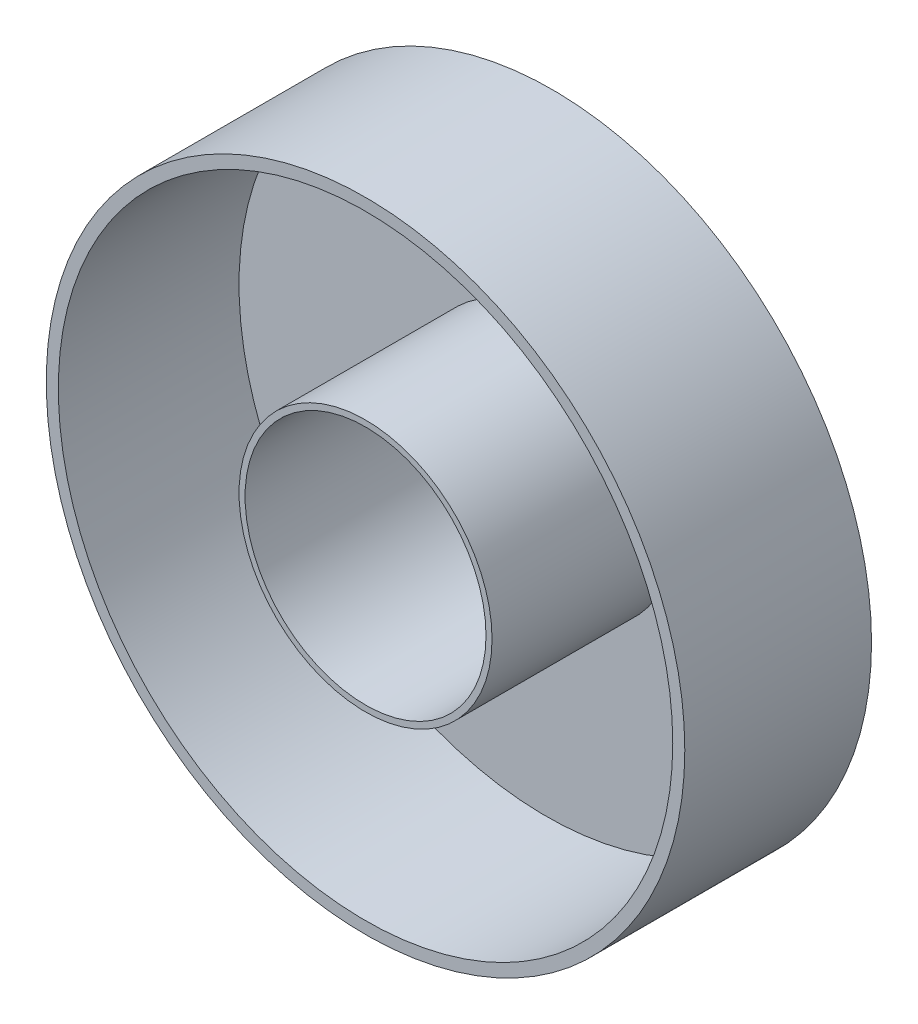
ISO-10303-21;
HEADER;
FILE_DESCRIPTION(('STEP AP214'),'2;1');
FILE_NAME('part.step','',(''),(''),'','','');
FILE_SCHEMA(('AUTOMOTIVE_DESIGN { 1 0 10303 214 1 1 1 1 }'));
ENDSEC;
DATA;
#1=APPLICATION_CONTEXT('core data for automotive mechanical design processes');
#2=APPLICATION_PROTOCOL_DEFINITION('international standard','automotive_design',2000,#1);
#3=PRODUCT_CONTEXT('',#1,'mechanical');
#4=PRODUCT('Part','Part','',(#3));
#5=PRODUCT_RELATED_PRODUCT_CATEGORY('part','',(#4));
#6=PRODUCT_DEFINITION_FORMATION('','',#4);
#7=PRODUCT_DEFINITION_CONTEXT('part definition',#1,'design');
#8=PRODUCT_DEFINITION('design','',#6,#7);
#9=PRODUCT_DEFINITION_SHAPE('','',#8);
#10=(LENGTH_UNIT() NAMED_UNIT(*) SI_UNIT(.MILLI.,.METRE.));
#11=(NAMED_UNIT(*) PLANE_ANGLE_UNIT() SI_UNIT($,.RADIAN.));
#12=(NAMED_UNIT(*) SI_UNIT($,.STERADIAN.) SOLID_ANGLE_UNIT());
#13=UNCERTAINTY_MEASURE_WITH_UNIT(LENGTH_MEASURE(1.E-05),#10,'distance_accuracy_value','');
#14=(GEOMETRIC_REPRESENTATION_CONTEXT(3) GLOBAL_UNCERTAINTY_ASSIGNED_CONTEXT((#13)) GLOBAL_UNIT_ASSIGNED_CONTEXT((#10,
#11,#12)) REPRESENTATION_CONTEXT('',''));
#15=CARTESIAN_POINT('',(0.,0.,0.));
#16=DIRECTION('',(0.,0.,1.));
#17=DIRECTION('',(1.,0.,0.));
#18=AXIS2_PLACEMENT_3D('',#15,#16,#17);
#19=CARTESIAN_POINT('',(0.,0.,15.5));
#20=DIRECTION('',(0.,0.,-1.));
#21=DIRECTION('',(-1.,0.,0.));
#22=AXIS2_PLACEMENT_3D('',#19,#20,#21);
#23=CYLINDRICAL_SURFACE('',#22,10.);
#24=CARTESIAN_POINT('',(0.,0.,15.5));
#25=DIRECTION('',(0.,0.,1.));
#26=DIRECTION('',(1.,0.,0.));
#27=AXIS2_PLACEMENT_3D('',#24,#25,#26);
#28=CIRCLE('',#27,10.);
#29=CARTESIAN_POINT('',(10.,0.,15.5));
#30=VERTEX_POINT('',#29);
#31=EDGE_CURVE('E78',#30,#30,#28,.T.);
#32=ORIENTED_EDGE('',*,*,#31,.T.);
#33=EDGE_LOOP('',(#32));
#34=FACE_BOUND('',#33,.T.);
#35=CARTESIAN_POINT('',(0.,0.,0.5));
#36=DIRECTION('',(0.,0.,1.));
#37=DIRECTION('',(1.,0.,0.));
#38=AXIS2_PLACEMENT_3D('',#35,#36,#37);
#39=CIRCLE('',#38,10.);
#40=CARTESIAN_POINT('',(10.,0.,0.5));
#41=VERTEX_POINT('',#40);
#42=EDGE_CURVE('E84',#41,#41,#39,.T.);
#43=ORIENTED_EDGE('',*,*,#42,.F.);
#44=EDGE_LOOP('',(#43));
#45=FACE_BOUND('',#44,.T.);
#46=ADVANCED_FACE('F71',(#34,#45),#23,.F.);
#47=CARTESIAN_POINT('',(0.,0.,15.5));
#48=DIRECTION('',(0.,0.,-1.));
#49=DIRECTION('',(-1.,0.,0.));
#50=AXIS2_PLACEMENT_3D('',#47,#48,#49);
#51=CYLINDRICAL_SURFACE('',#50,10.5);
#52=CARTESIAN_POINT('',(0.,0.,15.5));
#53=DIRECTION('',(0.,0.,1.));
#54=DIRECTION('',(1.,0.,0.));
#55=AXIS2_PLACEMENT_3D('',#52,#53,#54);
#56=CIRCLE('',#55,10.5);
#57=CARTESIAN_POINT('',(10.5,0.,15.5));
#58=VERTEX_POINT('',#57);
#59=EDGE_CURVE('E12',#58,#58,#56,.F.);
#60=ORIENTED_EDGE('',*,*,#59,.T.);
#61=EDGE_LOOP('',(#60));
#62=FACE_BOUND('',#61,.T.);
#63=CARTESIAN_POINT('',(0.,0.,0.5));
#64=DIRECTION('',(0.,0.,1.));
#65=DIRECTION('',(1.,0.,0.));
#66=AXIS2_PLACEMENT_3D('',#63,#64,#65);
#67=CIRCLE('',#66,10.5);
#68=CARTESIAN_POINT('',(10.5,0.,0.5));
#69=VERTEX_POINT('',#68);
#70=EDGE_CURVE('E74',#69,#69,#67,.F.);
#71=ORIENTED_EDGE('',*,*,#70,.F.);
#72=EDGE_LOOP('',(#71));
#73=FACE_BOUND('',#72,.T.);
#74=ADVANCED_FACE('F93',(#62,#73),#51,.T.);
#75=CARTESIAN_POINT('',(0.,0.,15.5));
#76=DIRECTION('',(0.,0.,1.));
#77=DIRECTION('',(1.,0.,0.));
#78=AXIS2_PLACEMENT_3D('',#75,#76,#77);
#79=PLANE('',#78);
#80=ORIENTED_EDGE('',*,*,#31,.F.);
#81=EDGE_LOOP('',(#80));
#82=FACE_BOUND('',#81,.T.);
#83=ORIENTED_EDGE('',*,*,#59,.F.);
#84=EDGE_LOOP('',(#83));
#85=FACE_BOUND('',#84,.T.);
#86=ADVANCED_FACE('F95',(#82,#85),#79,.T.);
#87=CARTESIAN_POINT('',(0.,0.,0.5));
#88=DIRECTION('',(0.,0.,1.));
#89=DIRECTION('',(1.,0.,0.));
#90=AXIS2_PLACEMENT_3D('',#87,#88,#89);
#91=PLANE('',#90);
#92=ORIENTED_EDGE('',*,*,#42,.T.);
#93=EDGE_LOOP('',(#92));
#94=FACE_BOUND('',#93,.T.);
#95=ORIENTED_EDGE('',*,*,#70,.T.);
#96=EDGE_LOOP('',(#95));
#97=FACE_BOUND('',#96,.T.);
#98=ADVANCED_FACE('F91',(#94,#97),#91,.F.);
#99=CLOSED_SHELL('',(#46,#74,#86,#98));
#100=MANIFOLD_SOLID_BREP('B2',#99);
#101=CARTESIAN_POINT('',(0.,0.,0.5));
#102=DIRECTION('',(0.,0.,-1.));
#103=DIRECTION('',(-1.,0.,0.));
#104=AXIS2_PLACEMENT_3D('',#101,#102,#103);
#105=CYLINDRICAL_SURFACE('',#104,26.5);
#106=CARTESIAN_POINT('',(0.,0.,0.));
#107=DIRECTION('',(0.,0.,1.));
#108=DIRECTION('',(1.,0.,0.));
#109=AXIS2_PLACEMENT_3D('',#106,#107,#108);
#110=CIRCLE('',#109,26.5);
#111=CARTESIAN_POINT('',(26.5,0.,0.));
#112=VERTEX_POINT('',#111);
#113=EDGE_CURVE('E143',#112,#112,#110,.T.);
#114=ORIENTED_EDGE('',*,*,#113,.T.);
#115=EDGE_LOOP('',(#114));
#116=FACE_BOUND('',#115,.T.);
#117=CARTESIAN_POINT('',(0.,0.,15.5));
#118=DIRECTION('',(0.,0.,1.));
#119=DIRECTION('',(1.,0.,0.));
#120=AXIS2_PLACEMENT_3D('',#117,#118,#119);
#121=CIRCLE('',#120,26.5);
#122=CARTESIAN_POINT('',(26.5,0.,15.5));
#123=VERTEX_POINT('',#122);
#124=EDGE_CURVE('E155',#123,#123,#121,.T.);
#125=ORIENTED_EDGE('',*,*,#124,.F.);
#126=EDGE_LOOP('',(#125));
#127=FACE_BOUND('',#126,.T.);
#128=ADVANCED_FACE('F136',(#116,#127),#105,.T.);
#129=CARTESIAN_POINT('',(0.,0.,0.));
#130=DIRECTION('',(0.,0.,1.));
#131=DIRECTION('',(1.,0.,0.));
#132=AXIS2_PLACEMENT_3D('',#129,#130,#131);
#133=PLANE('',#132);
#134=ORIENTED_EDGE('',*,*,#113,.F.);
#135=EDGE_LOOP('',(#134));
#136=FACE_BOUND('',#135,.T.);
#137=CARTESIAN_POINT('',(0.,0.,0.));
#138=DIRECTION('',(0.,0.,1.));
#139=DIRECTION('',(1.,0.,0.));
#140=AXIS2_PLACEMENT_3D('',#137,#138,#139);
#141=CIRCLE('',#140,10.5);
#142=CARTESIAN_POINT('',(10.5,0.,0.));
#143=VERTEX_POINT('',#142);
#144=EDGE_CURVE('E152',#143,#143,#141,.T.);
#145=ORIENTED_EDGE('',*,*,#144,.T.);
#146=EDGE_LOOP('',(#145));
#147=FACE_BOUND('',#146,.T.);
#148=ADVANCED_FACE('F177',(#136,#147),#133,.F.);
#149=CARTESIAN_POINT('',(0.,0.,0.5));
#150=DIRECTION('',(0.,0.,1.));
#151=DIRECTION('',(1.,0.,0.));
#152=AXIS2_PLACEMENT_3D('',#149,#150,#151);
#153=PLANE('',#152);
#154=CARTESIAN_POINT('',(0.,0.,0.5));
#155=DIRECTION('',(0.,0.,1.));
#156=DIRECTION('',(1.,0.,0.));
#157=AXIS2_PLACEMENT_3D('',#154,#155,#156);
#158=CIRCLE('',#157,25.5);
#159=CARTESIAN_POINT('',(25.5,0.,0.5));
#160=VERTEX_POINT('',#159);
#161=EDGE_CURVE('E70',#160,#160,#158,.F.);
#162=ORIENTED_EDGE('',*,*,#161,.F.);
#163=EDGE_LOOP('',(#162));
#164=FACE_BOUND('',#163,.T.);
#165=CARTESIAN_POINT('',(0.,0.,0.5));
#166=DIRECTION('',(0.,0.,1.));
#167=DIRECTION('',(1.,0.,0.));
#168=AXIS2_PLACEMENT_3D('',#165,#166,#167);
#169=CIRCLE('',#168,10.5);
#170=CARTESIAN_POINT('',(10.5,0.,0.5));
#171=VERTEX_POINT('',#170);
#172=EDGE_CURVE('E147',#171,#171,#169,.T.);
#173=ORIENTED_EDGE('',*,*,#172,.F.);
#174=EDGE_LOOP('',(#173));
#175=FACE_BOUND('',#174,.T.);
#176=ADVANCED_FACE('F181',(#164,#175),#153,.T.);
#177=CARTESIAN_POINT('',(0.,0.,0.5));
#178=DIRECTION('',(0.,0.,-1.));
#179=DIRECTION('',(-1.,0.,0.));
#180=AXIS2_PLACEMENT_3D('',#177,#178,#179);
#181=CYLINDRICAL_SURFACE('',#180,10.5);
#182=ORIENTED_EDGE('',*,*,#172,.T.);
#183=EDGE_LOOP('',(#182));
#184=FACE_BOUND('',#183,.T.);
#185=ORIENTED_EDGE('',*,*,#144,.F.);
#186=EDGE_LOOP('',(#185));
#187=FACE_BOUND('',#186,.T.);
#188=ADVANCED_FACE('F138',(#184,#187),#181,.F.);
#189=CARTESIAN_POINT('',(0.,0.,15.5));
#190=DIRECTION('',(0.,0.,-1.));
#191=DIRECTION('',(-1.,0.,0.));
#192=AXIS2_PLACEMENT_3D('',#189,#190,#191);
#193=CYLINDRICAL_SURFACE('',#192,25.5);
#194=CARTESIAN_POINT('',(0.,0.,15.5));
#195=DIRECTION('',(0.,0.,1.));
#196=DIRECTION('',(1.,0.,0.));
#197=AXIS2_PLACEMENT_3D('',#194,#195,#196);
#198=CIRCLE('',#197,25.5);
#199=CARTESIAN_POINT('',(25.5,0.,15.5));
#200=VERTEX_POINT('',#199);
#201=EDGE_CURVE('E161',#200,#200,#198,.T.);
#202=ORIENTED_EDGE('',*,*,#201,.T.);
#203=EDGE_LOOP('',(#202));
#204=FACE_BOUND('',#203,.T.);
#205=ORIENTED_EDGE('',*,*,#161,.T.);
#206=EDGE_LOOP('',(#205));
#207=FACE_BOUND('',#206,.T.);
#208=ADVANCED_FACE('F167',(#204,#207),#193,.F.);
#209=CARTESIAN_POINT('',(0.,0.,15.5));
#210=DIRECTION('',(0.,0.,1.));
#211=DIRECTION('',(1.,0.,0.));
#212=AXIS2_PLACEMENT_3D('',#209,#210,#211);
#213=PLANE('',#212);
#214=ORIENTED_EDGE('',*,*,#201,.F.);
#215=EDGE_LOOP('',(#214));
#216=FACE_BOUND('',#215,.T.);
#217=ORIENTED_EDGE('',*,*,#124,.T.);
#218=EDGE_LOOP('',(#217));
#219=FACE_BOUND('',#218,.T.);
#220=ADVANCED_FACE('F169',(#216,#219),#213,.T.);
#221=CLOSED_SHELL('',(#128,#148,#176,#188,#208,#220));
#222=MANIFOLD_SOLID_BREP('B7',#221);
#223=ADVANCED_BREP_SHAPE_REPRESENTATION('',(#18,#100,#222),#14);
#224=SHAPE_DEFINITION_REPRESENTATION(#9,#223);
ENDSEC;
END-ISO-10303-21;
